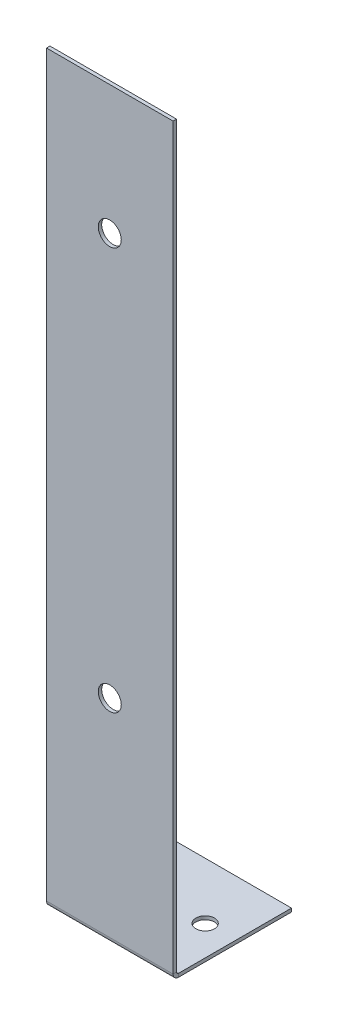
ISO-10303-21;
HEADER;
FILE_DESCRIPTION(('STEP AP214'),'2;1');
FILE_NAME('part.step','',(''),(''),'','','');
FILE_SCHEMA(('AUTOMOTIVE_DESIGN { 1 0 10303 214 1 1 1 1 }'));
ENDSEC;
DATA;
#1=APPLICATION_CONTEXT('core data for automotive mechanical design processes');
#2=APPLICATION_PROTOCOL_DEFINITION('international standard','automotive_design',2000,#1);
#3=PRODUCT_CONTEXT('',#1,'mechanical');
#4=PRODUCT('Part','Part','',(#3));
#5=PRODUCT_RELATED_PRODUCT_CATEGORY('part','',(#4));
#6=PRODUCT_DEFINITION_FORMATION('','',#4);
#7=PRODUCT_DEFINITION_CONTEXT('part definition',#1,'design');
#8=PRODUCT_DEFINITION('design','',#6,#7);
#9=PRODUCT_DEFINITION_SHAPE('','',#8);
#10=(LENGTH_UNIT() NAMED_UNIT(*) SI_UNIT(.MILLI.,.METRE.));
#11=(NAMED_UNIT(*) PLANE_ANGLE_UNIT() SI_UNIT($,.RADIAN.));
#12=(NAMED_UNIT(*) SI_UNIT($,.STERADIAN.) SOLID_ANGLE_UNIT());
#13=UNCERTAINTY_MEASURE_WITH_UNIT(LENGTH_MEASURE(1.E-05),#10,'distance_accuracy_value','');
#14=(GEOMETRIC_REPRESENTATION_CONTEXT(3) GLOBAL_UNCERTAINTY_ASSIGNED_CONTEXT((#13)) GLOBAL_UNIT_ASSIGNED_CONTEXT((#10,
#11,#12)) REPRESENTATION_CONTEXT('',''));
#15=CARTESIAN_POINT('',(0.,0.,0.));
#16=DIRECTION('',(0.,0.,1.));
#17=DIRECTION('',(1.,0.,0.));
#18=AXIS2_PLACEMENT_3D('',#15,#16,#17);
#19=CARTESIAN_POINT('',(-22.,-42.4,-108.8));
#20=DIRECTION('',(-1.,0.,0.));
#21=DIRECTION('',(0.,1.,0.));
#22=AXIS2_PLACEMENT_3D('',#19,#20,#21);
#23=PLANE('',#22);
#24=DIRECTION('',(0.,1.,0.));
#25=VECTOR('',#24,1.);
#26=CARTESIAN_POINT('',(-22.,-42.4,-110.));
#27=LINE('',#26,#25);
#28=CARTESIAN_POINT('',(-22.,0.736600000000001,-110.));
#29=VERTEX_POINT('',#28);
#30=CARTESIAN_POINT('',(-22.,257.6,-110.000000000001));
#31=VERTEX_POINT('',#30);
#32=EDGE_CURVE('E106',#29,#31,#27,.T.);
#33=ORIENTED_EDGE('',*,*,#32,.F.);
#34=DIRECTION('',(0.,0.,1.));
#35=VECTOR('',#34,1.);
#36=CARTESIAN_POINT('',(-22.,0.736600000000004,-108.8));
#37=LINE('',#36,#35);
#38=CARTESIAN_POINT('',(-22.,0.736600000000002,-108.8));
#39=VERTEX_POINT('',#38);
#40=EDGE_CURVE('E118',#29,#39,#37,.T.);
#41=ORIENTED_EDGE('',*,*,#40,.T.);
#42=DIRECTION('',(0.,1.,0.));
#43=VECTOR('',#42,1.);
#44=CARTESIAN_POINT('',(-22.,-42.4,-108.8));
#45=LINE('',#44,#43);
#46=CARTESIAN_POINT('',(-22.,257.6,-108.800000000001));
#47=VERTEX_POINT('',#46);
#48=EDGE_CURVE('E102',#39,#47,#45,.T.);
#49=ORIENTED_EDGE('',*,*,#48,.T.);
#50=DIRECTION('',(0.,0.,-1.));
#51=VECTOR('',#50,1.);
#52=CARTESIAN_POINT('',(-22.,257.6,-108.800000000001));
#53=LINE('',#52,#51);
#54=EDGE_CURVE('E95',#47,#31,#53,.T.);
#55=ORIENTED_EDGE('',*,*,#54,.T.);
#56=EDGE_LOOP('',(#33,#41,#49,#55));
#57=FACE_BOUND('',#56,.T.);
#58=ADVANCED_FACE('F49',(#57),#23,.T.);
#59=CARTESIAN_POINT('',(22.,-42.4,-108.8));
#60=DIRECTION('',(1.,0.,0.));
#61=DIRECTION('',(0.,-1.,0.));
#62=AXIS2_PLACEMENT_3D('',#59,#60,#61);
#63=PLANE('',#62);
#64=DIRECTION('',(0.,-1.,0.));
#65=VECTOR('',#64,1.);
#66=CARTESIAN_POINT('',(22.,-42.4,-108.8));
#67=LINE('',#66,#65);
#68=CARTESIAN_POINT('',(22.,257.6,-108.800000000001));
#69=VERTEX_POINT('',#68);
#70=CARTESIAN_POINT('',(22.,0.736600000000004,-108.8));
#71=VERTEX_POINT('',#70);
#72=EDGE_CURVE('E115',#69,#71,#67,.T.);
#73=ORIENTED_EDGE('',*,*,#72,.T.);
#74=DIRECTION('',(0.,0.,-1.));
#75=VECTOR('',#74,1.);
#76=CARTESIAN_POINT('',(22.,0.736600000000004,-108.8));
#77=LINE('',#76,#75);
#78=CARTESIAN_POINT('',(22.,0.736600000000001,-110.));
#79=VERTEX_POINT('',#78);
#80=EDGE_CURVE('E12',#71,#79,#77,.T.);
#81=ORIENTED_EDGE('',*,*,#80,.T.);
#82=DIRECTION('',(0.,-1.,0.));
#83=VECTOR('',#82,1.);
#84=CARTESIAN_POINT('',(22.,-42.4,-110.));
#85=LINE('',#84,#83);
#86=CARTESIAN_POINT('',(22.,257.6,-110.000000000001));
#87=VERTEX_POINT('',#86);
#88=EDGE_CURVE('E98',#87,#79,#85,.T.);
#89=ORIENTED_EDGE('',*,*,#88,.F.);
#90=DIRECTION('',(0.,0.,-1.));
#91=VECTOR('',#90,1.);
#92=CARTESIAN_POINT('',(22.,257.6,-108.800000000001));
#93=LINE('',#92,#91);
#94=EDGE_CURVE('E75',#69,#87,#93,.T.);
#95=ORIENTED_EDGE('',*,*,#94,.F.);
#96=EDGE_LOOP('',(#73,#81,#89,#95));
#97=FACE_BOUND('',#96,.T.);
#98=ADVANCED_FACE('F51',(#97),#63,.T.);
#99=CARTESIAN_POINT('',(0.,107.6,-108.8));
#100=DIRECTION('',(0.,0.,1.));
#101=DIRECTION('',(0.,-1.,0.));
#102=AXIS2_PLACEMENT_3D('',#99,#100,#101);
#103=PLANE('',#102);
#104=CARTESIAN_POINT('',(0.,72.7999999999999,-108.8));
#105=DIRECTION('',(0.,0.,1.));
#106=DIRECTION('',(1.,0.,0.));
#107=AXIS2_PLACEMENT_3D('',#104,#105,#106);
#108=CIRCLE('',#107,4.);
#109=CARTESIAN_POINT('',(4.,72.7999999999999,-108.8));
#110=VERTEX_POINT('',#109);
#111=EDGE_CURVE('E129',#110,#110,#108,.T.);
#112=ORIENTED_EDGE('',*,*,#111,.F.);
#113=EDGE_LOOP('',(#112));
#114=FACE_BOUND('',#113,.T.);
#115=CARTESIAN_POINT('',(0.,212.8,-108.8));
#116=DIRECTION('',(0.,0.,1.));
#117=DIRECTION('',(1.,0.,0.));
#118=AXIS2_PLACEMENT_3D('',#115,#116,#117);
#119=CIRCLE('',#118,4.);
#120=CARTESIAN_POINT('',(4.,212.8,-108.8));
#121=VERTEX_POINT('',#120);
#122=EDGE_CURVE('E138',#121,#121,#119,.T.);
#123=ORIENTED_EDGE('',*,*,#122,.F.);
#124=EDGE_LOOP('',(#123));
#125=FACE_BOUND('',#124,.T.);
#126=ORIENTED_EDGE('',*,*,#48,.F.);
#127=DIRECTION('',(1.,0.,0.));
#128=VECTOR('',#127,1.);
#129=CARTESIAN_POINT('',(0.,0.736600000000004,-108.8));
#130=LINE('',#129,#128);
#131=EDGE_CURVE('E94',#39,#71,#130,.T.);
#132=ORIENTED_EDGE('',*,*,#131,.T.);
#133=ORIENTED_EDGE('',*,*,#72,.F.);
#134=DIRECTION('',(1.,0.,0.));
#135=VECTOR('',#134,1.);
#136=CARTESIAN_POINT('',(22.,257.6,-108.800000000001));
#137=LINE('',#136,#135);
#138=EDGE_CURVE('E93',#47,#69,#137,.T.);
#139=ORIENTED_EDGE('',*,*,#138,.F.);
#140=EDGE_LOOP('',(#126,#132,#133,#139));
#141=FACE_BOUND('',#140,.T.);
#142=ADVANCED_FACE('F207',(#114,#125,#141),#103,.T.);
#143=CARTESIAN_POINT('',(22.,257.6,-108.800000000001));
#144=DIRECTION('',(0.,1.,0.));
#145=DIRECTION('',(1.,0.,0.));
#146=AXIS2_PLACEMENT_3D('',#143,#144,#145);
#147=PLANE('',#146);
#148=DIRECTION('',(1.,0.,0.));
#149=VECTOR('',#148,1.);
#150=CARTESIAN_POINT('',(22.,257.6,-110.000000000001));
#151=LINE('',#150,#149);
#152=EDGE_CURVE('E91',#31,#87,#151,.T.);
#153=ORIENTED_EDGE('',*,*,#152,.F.);
#154=ORIENTED_EDGE('',*,*,#54,.F.);
#155=ORIENTED_EDGE('',*,*,#138,.T.);
#156=ORIENTED_EDGE('',*,*,#94,.T.);
#157=EDGE_LOOP('',(#153,#154,#155,#156));
#158=FACE_BOUND('',#157,.T.);
#159=ADVANCED_FACE('F88',(#158),#147,.T.);
#160=CARTESIAN_POINT('',(0.,107.6,-110.));
#161=DIRECTION('',(0.,0.,1.));
#162=DIRECTION('',(0.,-1.,0.));
#163=AXIS2_PLACEMENT_3D('',#160,#161,#162);
#164=PLANE('',#163);
#165=CARTESIAN_POINT('',(0.,72.7999999999999,-110.));
#166=DIRECTION('',(0.,0.,1.));
#167=DIRECTION('',(0.,-1.,0.));
#168=AXIS2_PLACEMENT_3D('',#165,#166,#167);
#169=CIRCLE('',#168,4.);
#170=CARTESIAN_POINT('',(0.,68.7999999999999,-110.));
#171=VERTEX_POINT('',#170);
#172=EDGE_CURVE('E128',#171,#171,#169,.T.);
#173=ORIENTED_EDGE('',*,*,#172,.T.);
#174=EDGE_LOOP('',(#173));
#175=FACE_BOUND('',#174,.T.);
#176=CARTESIAN_POINT('',(0.,212.8,-110.000000000001));
#177=DIRECTION('',(0.,0.,1.));
#178=DIRECTION('',(0.,-1.,0.));
#179=AXIS2_PLACEMENT_3D('',#176,#177,#178);
#180=CIRCLE('',#179,4.);
#181=CARTESIAN_POINT('',(0.,208.8,-110.000000000001));
#182=VERTEX_POINT('',#181);
#183=EDGE_CURVE('E125',#182,#182,#180,.T.);
#184=ORIENTED_EDGE('',*,*,#183,.T.);
#185=EDGE_LOOP('',(#184));
#186=FACE_BOUND('',#185,.T.);
#187=DIRECTION('',(1.,0.,0.));
#188=VECTOR('',#187,1.);
#189=CARTESIAN_POINT('',(0.,0.736600000000004,-110.));
#190=LINE('',#189,#188);
#191=EDGE_CURVE('E58',#29,#79,#190,.T.);
#192=ORIENTED_EDGE('',*,*,#191,.F.);
#193=ORIENTED_EDGE('',*,*,#32,.T.);
#194=ORIENTED_EDGE('',*,*,#152,.T.);
#195=ORIENTED_EDGE('',*,*,#88,.T.);
#196=EDGE_LOOP('',(#192,#193,#194,#195));
#197=FACE_BOUND('',#196,.T.);
#198=ADVANCED_FACE('F104',(#175,#186,#197),#164,.F.);
#199=CARTESIAN_POINT('',(22.,-1.2,-150.));
#200=DIRECTION('',(0.,0.,-1.));
#201=DIRECTION('',(-1.,0.,0.));
#202=AXIS2_PLACEMENT_3D('',#199,#200,#201);
#203=PLANE('',#202);
#204=DIRECTION('',(-1.,0.,0.));
#205=VECTOR('',#204,1.);
#206=CARTESIAN_POINT('',(22.,0.,-150.));
#207=LINE('',#206,#205);
#208=CARTESIAN_POINT('',(22.,0.,-150.));
#209=VERTEX_POINT('',#208);
#210=CARTESIAN_POINT('',(-22.,0.,-150.));
#211=VERTEX_POINT('',#210);
#212=EDGE_CURVE('E166',#209,#211,#207,.T.);
#213=ORIENTED_EDGE('',*,*,#212,.F.);
#214=DIRECTION('',(0.,1.,0.));
#215=VECTOR('',#214,1.);
#216=CARTESIAN_POINT('',(22.,-1.2,-150.));
#217=LINE('',#216,#215);
#218=CARTESIAN_POINT('',(22.,-1.2,-150.));
#219=VERTEX_POINT('',#218);
#220=EDGE_CURVE('E109',#219,#209,#217,.T.);
#221=ORIENTED_EDGE('',*,*,#220,.F.);
#222=DIRECTION('',(-1.,0.,0.));
#223=VECTOR('',#222,1.);
#224=CARTESIAN_POINT('',(22.,-1.2,-150.));
#225=LINE('',#224,#223);
#226=CARTESIAN_POINT('',(-22.,-1.2,-150.));
#227=VERTEX_POINT('',#226);
#228=EDGE_CURVE('E184',#219,#227,#225,.T.);
#229=ORIENTED_EDGE('',*,*,#228,.T.);
#230=DIRECTION('',(0.,1.,0.));
#231=VECTOR('',#230,1.);
#232=CARTESIAN_POINT('',(-22.,-1.2,-150.));
#233=LINE('',#232,#231);
#234=EDGE_CURVE('E181',#227,#211,#233,.T.);
#235=ORIENTED_EDGE('',*,*,#234,.T.);
#236=EDGE_LOOP('',(#213,#221,#229,#235));
#237=FACE_BOUND('',#236,.T.);
#238=ADVANCED_FACE('F245',(#237),#203,.T.);
#239=CARTESIAN_POINT('',(0.,-1.2,0.));
#240=DIRECTION('',(0.,-1.,0.));
#241=DIRECTION('',(0.,0.,-1.));
#242=AXIS2_PLACEMENT_3D('',#239,#240,#241);
#243=PLANE('',#242);
#244=CARTESIAN_POINT('',(-11.6013408867385,-1.2,-130.3683));
#245=DIRECTION('',(0.,-1.,0.));
#246=DIRECTION('',(0.,0.,-1.));
#247=AXIS2_PLACEMENT_3D('',#244,#245,#246);
#248=CIRCLE('',#247,3.23430445854035);
#249=CARTESIAN_POINT('',(-11.6013408867385,-1.2,-133.60260445854));
#250=VERTEX_POINT('',#249);
#251=EDGE_CURVE('E134',#250,#250,#248,.T.);
#252=ORIENTED_EDGE('',*,*,#251,.F.);
#253=EDGE_LOOP('',(#252));
#254=FACE_BOUND('',#253,.T.);
#255=CARTESIAN_POINT('',(11.6013408867385,-1.2,-130.3683));
#256=DIRECTION('',(0.,-1.,0.));
#257=DIRECTION('',(0.,0.,1.));
#258=AXIS2_PLACEMENT_3D('',#255,#256,#257);
#259=CIRCLE('',#258,3.23430445854035);
#260=CARTESIAN_POINT('',(11.6013408867385,-1.2,-127.13399554146));
#261=VERTEX_POINT('',#260);
#262=EDGE_CURVE('E140',#261,#261,#259,.T.);
#263=ORIENTED_EDGE('',*,*,#262,.F.);
#264=EDGE_LOOP('',(#263));
#265=FACE_BOUND('',#264,.T.);
#266=DIRECTION('',(1.,0.,0.));
#267=VECTOR('',#266,1.);
#268=CARTESIAN_POINT('',(0.,-1.2,-110.7366));
#269=LINE('',#268,#267);
#270=CARTESIAN_POINT('',(-22.,-1.2,-110.7366));
#271=VERTEX_POINT('',#270);
#272=CARTESIAN_POINT('',(22.,-1.2,-110.7366));
#273=VERTEX_POINT('',#272);
#274=EDGE_CURVE('E156',#271,#273,#269,.T.);
#275=ORIENTED_EDGE('',*,*,#274,.F.);
#276=DIRECTION('',(0.,0.,1.));
#277=VECTOR('',#276,1.);
#278=CARTESIAN_POINT('',(-22.,-1.2,-150.));
#279=LINE('',#278,#277);
#280=EDGE_CURVE('E178',#227,#271,#279,.T.);
#281=ORIENTED_EDGE('',*,*,#280,.F.);
#282=ORIENTED_EDGE('',*,*,#228,.F.);
#283=DIRECTION('',(0.,0.,-1.));
#284=VECTOR('',#283,1.);
#285=CARTESIAN_POINT('',(22.,-1.2,-150.));
#286=LINE('',#285,#284);
#287=EDGE_CURVE('E163',#273,#219,#286,.T.);
#288=ORIENTED_EDGE('',*,*,#287,.F.);
#289=EDGE_LOOP('',(#275,#281,#282,#288));
#290=FACE_BOUND('',#289,.T.);
#291=ADVANCED_FACE('F246',(#254,#265,#290),#243,.T.);
#292=CARTESIAN_POINT('',(-22.,-1.2,-150.));
#293=DIRECTION('',(-1.,0.,0.));
#294=DIRECTION('',(0.,0.,1.));
#295=AXIS2_PLACEMENT_3D('',#292,#293,#294);
#296=PLANE('',#295);
#297=DIRECTION('',(0.,-1.,0.));
#298=VECTOR('',#297,1.);
#299=CARTESIAN_POINT('',(-22.,-1.2,-110.7366));
#300=LINE('',#299,#298);
#301=CARTESIAN_POINT('',(-22.,0.,-110.7366));
#302=VERTEX_POINT('',#301);
#303=EDGE_CURVE('E187',#302,#271,#300,.T.);
#304=ORIENTED_EDGE('',*,*,#303,.F.);
#305=DIRECTION('',(0.,0.,1.));
#306=VECTOR('',#305,1.);
#307=CARTESIAN_POINT('',(-22.,0.,-150.));
#308=LINE('',#307,#306);
#309=EDGE_CURVE('E175',#211,#302,#308,.T.);
#310=ORIENTED_EDGE('',*,*,#309,.F.);
#311=ORIENTED_EDGE('',*,*,#234,.F.);
#312=ORIENTED_EDGE('',*,*,#280,.T.);
#313=EDGE_LOOP('',(#304,#310,#311,#312));
#314=FACE_BOUND('',#313,.T.);
#315=ADVANCED_FACE('F221',(#314),#296,.T.);
#316=CARTESIAN_POINT('',(0.,0.,0.));
#317=DIRECTION('',(0.,-1.,0.));
#318=DIRECTION('',(0.,0.,-1.));
#319=AXIS2_PLACEMENT_3D('',#316,#317,#318);
#320=PLANE('',#319);
#321=CARTESIAN_POINT('',(-11.6013408867385,0.,-130.3683));
#322=DIRECTION('',(0.,-1.,0.));
#323=DIRECTION('',(0.,0.,-1.));
#324=AXIS2_PLACEMENT_3D('',#321,#322,#323);
#325=CIRCLE('',#324,3.23430445854035);
#326=CARTESIAN_POINT('',(-11.6013408867385,0.,-133.60260445854));
#327=VERTEX_POINT('',#326);
#328=EDGE_CURVE('E53',#327,#327,#325,.T.);
#329=ORIENTED_EDGE('',*,*,#328,.T.);
#330=EDGE_LOOP('',(#329));
#331=FACE_BOUND('',#330,.T.);
#332=CARTESIAN_POINT('',(11.6013408867385,0.,-130.3683));
#333=DIRECTION('',(0.,-1.,0.));
#334=DIRECTION('',(0.,0.,-1.));
#335=AXIS2_PLACEMENT_3D('',#332,#333,#334);
#336=CIRCLE('',#335,3.23430445854035);
#337=CARTESIAN_POINT('',(11.6013408867385,0.,-133.60260445854));
#338=VERTEX_POINT('',#337);
#339=EDGE_CURVE('E132',#338,#338,#336,.T.);
#340=ORIENTED_EDGE('',*,*,#339,.T.);
#341=EDGE_LOOP('',(#340));
#342=FACE_BOUND('',#341,.T.);
#343=ORIENTED_EDGE('',*,*,#309,.T.);
#344=DIRECTION('',(1.,0.,0.));
#345=VECTOR('',#344,1.);
#346=CARTESIAN_POINT('',(0.,0.,-110.7366));
#347=LINE('',#346,#345);
#348=CARTESIAN_POINT('',(22.,0.,-110.7366));
#349=VERTEX_POINT('',#348);
#350=EDGE_CURVE('E172',#302,#349,#347,.T.);
#351=ORIENTED_EDGE('',*,*,#350,.T.);
#352=DIRECTION('',(0.,0.,-1.));
#353=VECTOR('',#352,1.);
#354=CARTESIAN_POINT('',(22.,0.,-150.));
#355=LINE('',#354,#353);
#356=EDGE_CURVE('E169',#349,#209,#355,.T.);
#357=ORIENTED_EDGE('',*,*,#356,.T.);
#358=ORIENTED_EDGE('',*,*,#212,.T.);
#359=EDGE_LOOP('',(#343,#351,#357,#358));
#360=FACE_BOUND('',#359,.T.);
#361=ADVANCED_FACE('F228',(#331,#342,#360),#320,.F.);
#362=CARTESIAN_POINT('',(22.,-1.2,-150.));
#363=DIRECTION('',(1.,0.,0.));
#364=DIRECTION('',(0.,0.,-1.));
#365=AXIS2_PLACEMENT_3D('',#362,#363,#364);
#366=PLANE('',#365);
#367=DIRECTION('',(0.,1.,0.));
#368=VECTOR('',#367,1.);
#369=CARTESIAN_POINT('',(22.,-1.2,-110.7366));
#370=LINE('',#369,#368);
#371=EDGE_CURVE('E190',#273,#349,#370,.T.);
#372=ORIENTED_EDGE('',*,*,#371,.F.);
#373=ORIENTED_EDGE('',*,*,#287,.T.);
#374=ORIENTED_EDGE('',*,*,#220,.T.);
#375=ORIENTED_EDGE('',*,*,#356,.F.);
#376=EDGE_LOOP('',(#372,#373,#374,#375));
#377=FACE_BOUND('',#376,.T.);
#378=ADVANCED_FACE('F241',(#377),#366,.T.);
#379=CARTESIAN_POINT('',(-22.,0.7366,-110.7366));
#380=DIRECTION('',(-1.,0.,0.));
#381=DIRECTION('',(0.,0.,1.));
#382=AXIS2_PLACEMENT_3D('',#379,#380,#381);
#383=PLANE('',#382);
#384=ORIENTED_EDGE('',*,*,#40,.F.);
#385=CARTESIAN_POINT('',(-22.,0.7366,-110.7366));
#386=DIRECTION('',(-1.,0.,0.));
#387=DIRECTION('',(0.,0.,1.));
#388=AXIS2_PLACEMENT_3D('',#385,#386,#387);
#389=CIRCLE('',#388,0.7366);
#390=EDGE_CURVE('E131',#29,#302,#389,.F.);
#391=ORIENTED_EDGE('',*,*,#390,.T.);
#392=ORIENTED_EDGE('',*,*,#303,.T.);
#393=CARTESIAN_POINT('',(-22.,0.7366,-110.7366));
#394=DIRECTION('',(1.,0.,0.));
#395=DIRECTION('',(0.,0.,1.));
#396=AXIS2_PLACEMENT_3D('',#393,#394,#395);
#397=CIRCLE('',#396,1.9366);
#398=EDGE_CURVE('E151',#39,#271,#397,.T.);
#399=ORIENTED_EDGE('',*,*,#398,.F.);
#400=EDGE_LOOP('',(#384,#391,#392,#399));
#401=FACE_BOUND('',#400,.T.);
#402=ADVANCED_FACE('F213',(#401),#383,.T.);
#403=CARTESIAN_POINT('',(22.,0.7366,-110.7366));
#404=DIRECTION('',(1.,0.,0.));
#405=DIRECTION('',(0.,0.,-1.));
#406=AXIS2_PLACEMENT_3D('',#403,#404,#405);
#407=PLANE('',#406);
#408=CARTESIAN_POINT('',(22.,0.7366,-110.7366));
#409=DIRECTION('',(-1.,0.,0.));
#410=DIRECTION('',(0.,0.,1.));
#411=AXIS2_PLACEMENT_3D('',#408,#409,#410);
#412=CIRCLE('',#411,0.7366);
#413=EDGE_CURVE('E154',#349,#79,#412,.T.);
#414=ORIENTED_EDGE('',*,*,#413,.T.);
#415=ORIENTED_EDGE('',*,*,#80,.F.);
#416=CARTESIAN_POINT('',(22.,0.7366,-110.7366));
#417=DIRECTION('',(-1.,0.,0.));
#418=DIRECTION('',(0.,0.,-1.));
#419=AXIS2_PLACEMENT_3D('',#416,#417,#418);
#420=CIRCLE('',#419,1.9366);
#421=EDGE_CURVE('E66',#273,#71,#420,.T.);
#422=ORIENTED_EDGE('',*,*,#421,.F.);
#423=ORIENTED_EDGE('',*,*,#371,.T.);
#424=EDGE_LOOP('',(#414,#415,#422,#423));
#425=FACE_BOUND('',#424,.T.);
#426=ADVANCED_FACE('F202',(#425),#407,.T.);
#427=CARTESIAN_POINT('',(44.1864422446524,0.7366,-110.7366));
#428=DIRECTION('',(-1.,0.,0.));
#429=DIRECTION('',(0.,0.,1.));
#430=AXIS2_PLACEMENT_3D('',#427,#428,#429);
#431=CYLINDRICAL_SURFACE('',#430,1.9366);
#432=ORIENTED_EDGE('',*,*,#274,.T.);
#433=ORIENTED_EDGE('',*,*,#421,.T.);
#434=ORIENTED_EDGE('',*,*,#131,.F.);
#435=ORIENTED_EDGE('',*,*,#398,.T.);
#436=EDGE_LOOP('',(#432,#433,#434,#435));
#437=FACE_BOUND('',#436,.T.);
#438=ADVANCED_FACE('F194',(#437),#431,.T.);
#439=CARTESIAN_POINT('',(44.1864422446524,0.7366,-110.7366));
#440=DIRECTION('',(-1.,0.,0.));
#441=DIRECTION('',(0.,0.,1.));
#442=AXIS2_PLACEMENT_3D('',#439,#440,#441);
#443=CYLINDRICAL_SURFACE('',#442,0.7366);
#444=ORIENTED_EDGE('',*,*,#350,.F.);
#445=ORIENTED_EDGE('',*,*,#390,.F.);
#446=ORIENTED_EDGE('',*,*,#191,.T.);
#447=ORIENTED_EDGE('',*,*,#413,.F.);
#448=EDGE_LOOP('',(#444,#445,#446,#447));
#449=FACE_BOUND('',#448,.T.);
#450=ADVANCED_FACE('F226',(#449),#443,.F.);
#451=CARTESIAN_POINT('',(0.,212.8,-118.8));
#452=DIRECTION('',(0.,0.,1.));
#453=DIRECTION('',(1.,0.,0.));
#454=AXIS2_PLACEMENT_3D('',#451,#452,#453);
#455=CYLINDRICAL_SURFACE('',#454,4.);
#456=ORIENTED_EDGE('',*,*,#122,.T.);
#457=EDGE_LOOP('',(#456));
#458=FACE_BOUND('',#457,.T.);
#459=ORIENTED_EDGE('',*,*,#183,.F.);
#460=EDGE_LOOP('',(#459));
#461=FACE_BOUND('',#460,.T.);
#462=ADVANCED_FACE('F278',(#458,#461),#455,.F.);
#463=CARTESIAN_POINT('',(0.,72.7999999999999,-118.8));
#464=DIRECTION('',(0.,0.,1.));
#465=DIRECTION('',(1.,0.,0.));
#466=AXIS2_PLACEMENT_3D('',#463,#464,#465);
#467=CYLINDRICAL_SURFACE('',#466,4.);
#468=ORIENTED_EDGE('',*,*,#111,.T.);
#469=EDGE_LOOP('',(#468));
#470=FACE_BOUND('',#469,.T.);
#471=ORIENTED_EDGE('',*,*,#172,.F.);
#472=EDGE_LOOP('',(#471));
#473=FACE_BOUND('',#472,.T.);
#474=ADVANCED_FACE('F279',(#470,#473),#467,.F.);
#475=CARTESIAN_POINT('',(11.6013408867385,8.8,-130.3683));
#476=DIRECTION('',(0.,-1.,0.));
#477=DIRECTION('',(0.,0.,-1.));
#478=AXIS2_PLACEMENT_3D('',#475,#476,#477);
#479=CYLINDRICAL_SURFACE('',#478,3.23430445854035);
#480=ORIENTED_EDGE('',*,*,#262,.T.);
#481=EDGE_LOOP('',(#480));
#482=FACE_BOUND('',#481,.T.);
#483=ORIENTED_EDGE('',*,*,#339,.F.);
#484=EDGE_LOOP('',(#483));
#485=FACE_BOUND('',#484,.T.);
#486=ADVANCED_FACE('F284',(#482,#485),#479,.F.);
#487=CARTESIAN_POINT('',(-11.6013408867385,8.8,-130.3683));
#488=DIRECTION('',(0.,-1.,0.));
#489=DIRECTION('',(0.,0.,-1.));
#490=AXIS2_PLACEMENT_3D('',#487,#488,#489);
#491=CYLINDRICAL_SURFACE('',#490,3.23430445854035);
#492=ORIENTED_EDGE('',*,*,#251,.T.);
#493=EDGE_LOOP('',(#492));
#494=FACE_BOUND('',#493,.T.);
#495=ORIENTED_EDGE('',*,*,#328,.F.);
#496=EDGE_LOOP('',(#495));
#497=FACE_BOUND('',#496,.T.);
#498=ADVANCED_FACE('F371',(#494,#497),#491,.F.);
#499=CLOSED_SHELL('',(#58,#98,#142,#159,#198,#238,#291,#315,#361,#378,#402,#426,#438,#450,#462,
#474,#486,#498));
#500=MANIFOLD_SOLID_BREP('B2',#499);
#501=ADVANCED_BREP_SHAPE_REPRESENTATION('',(#18,#500),#14);
#502=SHAPE_DEFINITION_REPRESENTATION(#9,#501);
ENDSEC;
END-ISO-10303-21;
